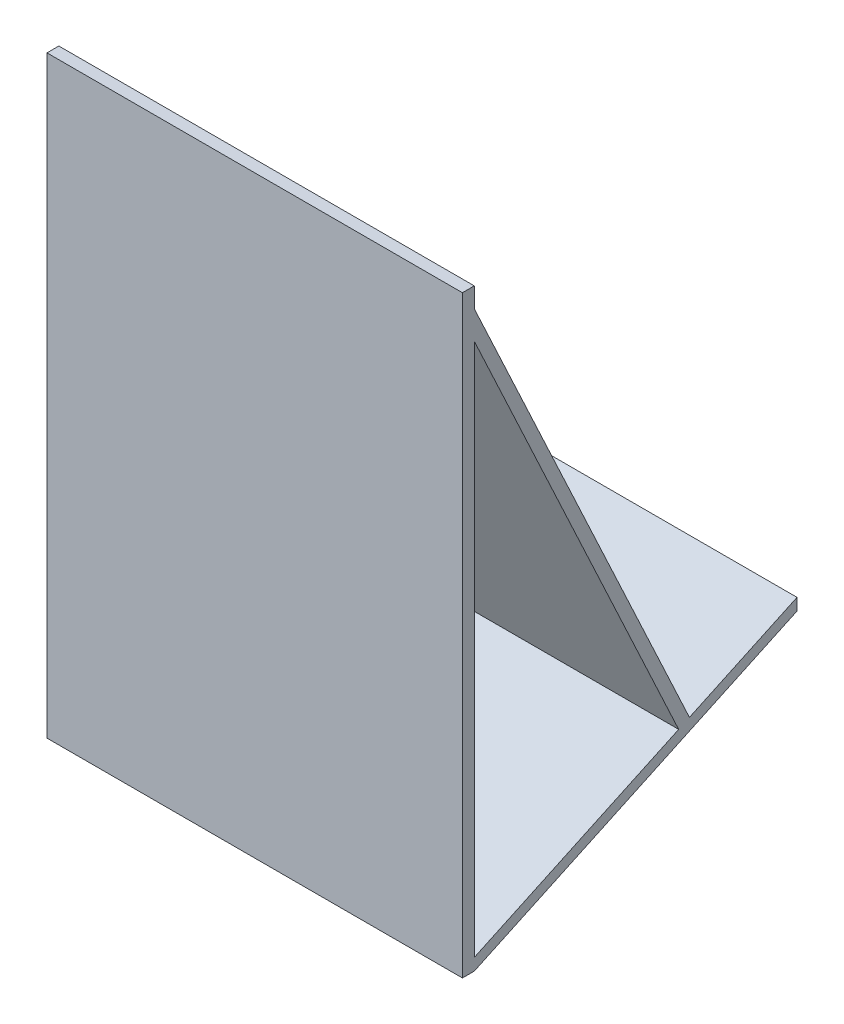
ISO-10303-21;
HEADER;
FILE_DESCRIPTION(('STEP AP214'),'2;1');
FILE_NAME('part.step','',(''),(''),'','','');
FILE_SCHEMA(('AUTOMOTIVE_DESIGN { 1 0 10303 214 1 1 1 1 }'));
ENDSEC;
DATA;
#1=APPLICATION_CONTEXT('core data for automotive mechanical design processes');
#2=APPLICATION_PROTOCOL_DEFINITION('international standard','automotive_design',2000,#1);
#3=PRODUCT_CONTEXT('',#1,'mechanical');
#4=PRODUCT('Part','Part','',(#3));
#5=PRODUCT_RELATED_PRODUCT_CATEGORY('part','',(#4));
#6=PRODUCT_DEFINITION_FORMATION('','',#4);
#7=PRODUCT_DEFINITION_CONTEXT('part definition',#1,'design');
#8=PRODUCT_DEFINITION('design','',#6,#7);
#9=PRODUCT_DEFINITION_SHAPE('','',#8);
#10=(LENGTH_UNIT() NAMED_UNIT(*) SI_UNIT(.MILLI.,.METRE.));
#11=(NAMED_UNIT(*) PLANE_ANGLE_UNIT() SI_UNIT($,.RADIAN.));
#12=(NAMED_UNIT(*) SI_UNIT($,.STERADIAN.) SOLID_ANGLE_UNIT());
#13=UNCERTAINTY_MEASURE_WITH_UNIT(LENGTH_MEASURE(1.E-05),#10,'distance_accuracy_value','');
#14=(GEOMETRIC_REPRESENTATION_CONTEXT(3) GLOBAL_UNCERTAINTY_ASSIGNED_CONTEXT((#13)) GLOBAL_UNIT_ASSIGNED_CONTEXT((#10,
#11,#12)) REPRESENTATION_CONTEXT('',''));
#15=CARTESIAN_POINT('',(0.,0.,0.));
#16=DIRECTION('',(0.,0.,1.));
#17=DIRECTION('',(1.,0.,0.));
#18=AXIS2_PLACEMENT_3D('',#15,#16,#17);
#19=CARTESIAN_POINT('',(70.,100.,4.));
#20=DIRECTION('',(-1.,0.,0.));
#21=DIRECTION('',(0.,-1.,0.));
#22=AXIS2_PLACEMENT_3D('',#19,#20,#21);
#23=PLANE('',#22);
#24=DIRECTION('',(0.,1.,0.));
#25=VECTOR('',#24,1.);
#26=CARTESIAN_POINT('',(70.,100.,0.));
#27=LINE('',#26,#25);
#28=CARTESIAN_POINT('',(70.,-96.,0.));
#29=VERTEX_POINT('',#28);
#30=CARTESIAN_POINT('',(70.,83.8313203195882,0.));
#31=VERTEX_POINT('',#30);
#32=EDGE_CURVE('E216',#29,#31,#27,.T.);
#33=ORIENTED_EDGE('',*,*,#32,.T.);
#34=DIRECTION('',(0.,-0.906307787036648,-0.422618261740704));
#35=VECTOR('',#34,1.);
#36=CARTESIAN_POINT('',(70.,94.7228506237069,5.07880398983786));
#37=LINE('',#36,#35);
#38=CARTESIAN_POINT('',(70.,-63.8810121077065,-68.8793918147853));
#39=VERTEX_POINT('',#38);
#40=EDGE_CURVE('E160',#31,#39,#37,.T.);
#41=ORIENTED_EDGE('',*,*,#40,.T.);
#42=DIRECTION('',(0.,-0.422618261740704,0.906307787036648));
#43=VECTOR('',#42,1.);
#44=CARTESIAN_POINT('',(70.,-45.2858085911155,-108.756934444398));
#45=LINE('',#44,#43);
#46=EDGE_CURVE('E185',#39,#29,#45,.T.);
#47=ORIENTED_EDGE('',*,*,#46,.T.);
#48=EDGE_LOOP('',(#33,#41,#47));
#49=FACE_BOUND('',#48,.T.);
#50=DIRECTION('',(0.,0.,-1.));
#51=VECTOR('',#50,1.);
#52=CARTESIAN_POINT('',(70.,100.,4.));
#53=LINE('',#52,#51);
#54=CARTESIAN_POINT('',(70.,100.,4.));
#55=VERTEX_POINT('',#54);
#56=CARTESIAN_POINT('',(70.,100.,0.));
#57=VERTEX_POINT('',#56);
#58=EDGE_CURVE('E11',#55,#57,#53,.T.);
#59=ORIENTED_EDGE('',*,*,#58,.F.);
#60=DIRECTION('',(0.,1.,0.));
#61=VECTOR('',#60,1.);
#62=CARTESIAN_POINT('',(70.,100.,4.));
#63=LINE('',#62,#61);
#64=CARTESIAN_POINT('',(70.,-100.,4.));
#65=VERTEX_POINT('',#64);
#66=EDGE_CURVE('E202',#65,#55,#63,.T.);
#67=ORIENTED_EDGE('',*,*,#66,.F.);
#68=DIRECTION('',(0.,0.,-1.));
#69=VECTOR('',#68,1.);
#70=CARTESIAN_POINT('',(70.,-100.,4.));
#71=LINE('',#70,#69);
#72=CARTESIAN_POINT('',(70.,-100.,0.));
#73=VERTEX_POINT('',#72);
#74=EDGE_CURVE('E215',#65,#73,#71,.T.);
#75=ORIENTED_EDGE('',*,*,#74,.T.);
#76=DIRECTION('',(0.,0.422618261740704,-0.906307787036648));
#77=VECTOR('',#76,1.);
#78=CARTESIAN_POINT('',(70.,-100.,0.));
#79=LINE('',#78,#77);
#80=CARTESIAN_POINT('',(70.,-49.2858085911155,-108.756934444398));
#81=VERTEX_POINT('',#80);
#82=EDGE_CURVE('E189',#73,#81,#79,.T.);
#83=ORIENTED_EDGE('',*,*,#82,.T.);
#84=DIRECTION('',(0.,1.,0.));
#85=VECTOR('',#84,1.);
#86=CARTESIAN_POINT('',(70.,-49.2858085911155,-108.756934444398));
#87=LINE('',#86,#85);
#88=CARTESIAN_POINT('',(70.,-45.2858085911155,-108.756934444398));
#89=VERTEX_POINT('',#88);
#90=EDGE_CURVE('E181',#81,#89,#87,.T.);
#91=ORIENTED_EDGE('',*,*,#90,.T.);
#92=CARTESIAN_POINT('',(70.,-62.1905390607437,-72.5046229629319));
#93=VERTEX_POINT('',#92);
#94=EDGE_CURVE('E186',#89,#93,#45,.T.);
#95=ORIENTED_EDGE('',*,*,#94,.T.);
#96=DIRECTION('',(0.,-0.906307787036648,-0.422618261740704));
#97=VECTOR('',#96,1.);
#98=CARTESIAN_POINT('',(70.,96.4133236706697,1.45357284169126));
#99=LINE('',#98,#97);
#100=CARTESIAN_POINT('',(70.,93.2961266521981,0.));
#101=VERTEX_POINT('',#100);
#102=EDGE_CURVE('E146',#101,#93,#99,.T.);
#103=ORIENTED_EDGE('',*,*,#102,.F.);
#104=EDGE_CURVE('E201',#101,#57,#27,.T.);
#105=ORIENTED_EDGE('',*,*,#104,.T.);
#106=EDGE_LOOP('',(#59,#67,#75,#83,#91,#95,#103,#105));
#107=FACE_BOUND('',#106,.T.);
#108=ADVANCED_FACE('F39',(#49,#107),#23,.F.);
#109=CARTESIAN_POINT('',(-70.,100.,4.));
#110=DIRECTION('',(1.,0.,0.));
#111=DIRECTION('',(0.,1.,0.));
#112=AXIS2_PLACEMENT_3D('',#109,#110,#111);
#113=PLANE('',#112);
#114=DIRECTION('',(0.,-0.906307787036648,-0.422618261740704));
#115=VECTOR('',#114,1.);
#116=CARTESIAN_POINT('',(-70.,94.7228506237069,5.07880398983786));
#117=LINE('',#116,#115);
#118=CARTESIAN_POINT('',(-70.,83.8313203195882,0.));
#119=VERTEX_POINT('',#118);
#120=CARTESIAN_POINT('',(-70.,-63.8810121077065,-68.8793918147853));
#121=VERTEX_POINT('',#120);
#122=EDGE_CURVE('E164',#119,#121,#117,.T.);
#123=ORIENTED_EDGE('',*,*,#122,.F.);
#124=DIRECTION('',(0.,-1.,0.));
#125=VECTOR('',#124,1.);
#126=CARTESIAN_POINT('',(-70.,100.,0.));
#127=LINE('',#126,#125);
#128=CARTESIAN_POINT('',(-70.,-96.,0.));
#129=VERTEX_POINT('',#128);
#130=EDGE_CURVE('E59',#119,#129,#127,.T.);
#131=ORIENTED_EDGE('',*,*,#130,.T.);
#132=DIRECTION('',(0.,0.422618261740704,-0.906307787036648));
#133=VECTOR('',#132,1.);
#134=CARTESIAN_POINT('',(-70.,-96.,0.));
#135=LINE('',#134,#133);
#136=EDGE_CURVE('E132',#129,#121,#135,.T.);
#137=ORIENTED_EDGE('',*,*,#136,.T.);
#138=EDGE_LOOP('',(#123,#131,#137));
#139=FACE_BOUND('',#138,.T.);
#140=DIRECTION('',(0.,0.,-1.));
#141=VECTOR('',#140,1.);
#142=CARTESIAN_POINT('',(-70.,-100.,4.));
#143=LINE('',#142,#141);
#144=CARTESIAN_POINT('',(-70.,-100.,4.));
#145=VERTEX_POINT('',#144);
#146=CARTESIAN_POINT('',(-70.,-100.,0.));
#147=VERTEX_POINT('',#146);
#148=EDGE_CURVE('E229',#145,#147,#143,.T.);
#149=ORIENTED_EDGE('',*,*,#148,.F.);
#150=DIRECTION('',(0.,-1.,0.));
#151=VECTOR('',#150,1.);
#152=CARTESIAN_POINT('',(-70.,100.,4.));
#153=LINE('',#152,#151);
#154=CARTESIAN_POINT('',(-70.,100.,4.));
#155=VERTEX_POINT('',#154);
#156=EDGE_CURVE('E209',#155,#145,#153,.T.);
#157=ORIENTED_EDGE('',*,*,#156,.F.);
#158=DIRECTION('',(0.,0.,-1.));
#159=VECTOR('',#158,1.);
#160=CARTESIAN_POINT('',(-70.,100.,4.));
#161=LINE('',#160,#159);
#162=CARTESIAN_POINT('',(-70.,100.,0.));
#163=VERTEX_POINT('',#162);
#164=EDGE_CURVE('E47',#155,#163,#161,.T.);
#165=ORIENTED_EDGE('',*,*,#164,.T.);
#166=CARTESIAN_POINT('',(-70.,93.2961266521981,0.));
#167=VERTEX_POINT('',#166);
#168=EDGE_CURVE('E142',#163,#167,#127,.T.);
#169=ORIENTED_EDGE('',*,*,#168,.T.);
#170=DIRECTION('',(0.,-0.906307787036648,-0.422618261740704));
#171=VECTOR('',#170,1.);
#172=CARTESIAN_POINT('',(-70.,96.4133236706697,1.45357284169126));
#173=LINE('',#172,#171);
#174=CARTESIAN_POINT('',(-70.,-62.1905390607437,-72.5046229629319));
#175=VERTEX_POINT('',#174);
#176=EDGE_CURVE('E137',#167,#175,#173,.T.);
#177=ORIENTED_EDGE('',*,*,#176,.T.);
#178=CARTESIAN_POINT('',(-70.,-45.2858085911155,-108.756934444398));
#179=VERTEX_POINT('',#178);
#180=EDGE_CURVE('E120',#175,#179,#135,.T.);
#181=ORIENTED_EDGE('',*,*,#180,.T.);
#182=DIRECTION('',(0.,-1.,0.));
#183=VECTOR('',#182,1.);
#184=CARTESIAN_POINT('',(-70.,-45.2858085911155,-108.756934444398));
#185=LINE('',#184,#183);
#186=CARTESIAN_POINT('',(-70.,-49.2858085911156,-108.756934444398));
#187=VERTEX_POINT('',#186);
#188=EDGE_CURVE('E173',#179,#187,#185,.T.);
#189=ORIENTED_EDGE('',*,*,#188,.T.);
#190=DIRECTION('',(0.,-0.422618261740704,0.906307787036648));
#191=VECTOR('',#190,1.);
#192=CARTESIAN_POINT('',(-70.,-49.2858085911156,-108.756934444398));
#193=LINE('',#192,#191);
#194=EDGE_CURVE('E133',#187,#147,#193,.T.);
#195=ORIENTED_EDGE('',*,*,#194,.T.);
#196=EDGE_LOOP('',(#149,#157,#165,#169,#177,#181,#189,#195));
#197=FACE_BOUND('',#196,.T.);
#198=ADVANCED_FACE('F139',(#139,#197),#113,.F.);
#199=CARTESIAN_POINT('',(0.,0.,4.));
#200=DIRECTION('',(0.,0.,1.));
#201=DIRECTION('',(1.,0.,0.));
#202=AXIS2_PLACEMENT_3D('',#199,#200,#201);
#203=PLANE('',#202);
#204=ORIENTED_EDGE('',*,*,#156,.T.);
#205=DIRECTION('',(1.,0.,0.));
#206=VECTOR('',#205,1.);
#207=CARTESIAN_POINT('',(-70.,-100.,4.));
#208=LINE('',#207,#206);
#209=EDGE_CURVE('E212',#145,#65,#208,.T.);
#210=ORIENTED_EDGE('',*,*,#209,.T.);
#211=ORIENTED_EDGE('',*,*,#66,.T.);
#212=DIRECTION('',(-1.,0.,0.));
#213=VECTOR('',#212,1.);
#214=CARTESIAN_POINT('',(-70.,100.,4.));
#215=LINE('',#214,#213);
#216=EDGE_CURVE('E205',#55,#155,#215,.T.);
#217=ORIENTED_EDGE('',*,*,#216,.T.);
#218=EDGE_LOOP('',(#204,#210,#211,#217));
#219=FACE_BOUND('',#218,.T.);
#220=ADVANCED_FACE('F255',(#219),#203,.T.);
#221=CARTESIAN_POINT('',(0.,0.,0.));
#222=DIRECTION('',(0.,0.,1.));
#223=DIRECTION('',(1.,0.,0.));
#224=AXIS2_PLACEMENT_3D('',#221,#222,#223);
#225=PLANE('',#224);
#226=DIRECTION('',(-1.,0.,0.));
#227=VECTOR('',#226,1.);
#228=CARTESIAN_POINT('',(0.,83.8313203195882,0.));
#229=LINE('',#228,#227);
#230=EDGE_CURVE('E54',#31,#119,#229,.T.);
#231=ORIENTED_EDGE('',*,*,#230,.F.);
#232=ORIENTED_EDGE('',*,*,#32,.F.);
#233=DIRECTION('',(-1.,0.,0.));
#234=VECTOR('',#233,1.);
#235=CARTESIAN_POINT('',(1.00000000000004,-96.,0.));
#236=LINE('',#235,#234);
#237=EDGE_CURVE('E193',#29,#129,#236,.T.);
#238=ORIENTED_EDGE('',*,*,#237,.T.);
#239=ORIENTED_EDGE('',*,*,#130,.F.);
#240=EDGE_LOOP('',(#231,#232,#238,#239));
#241=FACE_BOUND('',#240,.T.);
#242=ADVANCED_FACE('F281',(#241),#225,.F.);
#243=DIRECTION('',(1.,0.,0.));
#244=VECTOR('',#243,1.);
#245=CARTESIAN_POINT('',(0.,93.2961266521981,0.));
#246=LINE('',#245,#244);
#247=EDGE_CURVE('E168',#167,#101,#246,.T.);
#248=ORIENTED_EDGE('',*,*,#247,.F.);
#249=ORIENTED_EDGE('',*,*,#168,.F.);
#250=DIRECTION('',(-1.,0.,0.));
#251=VECTOR('',#250,1.);
#252=CARTESIAN_POINT('',(-70.,100.,0.));
#253=LINE('',#252,#251);
#254=EDGE_CURVE('E219',#57,#163,#253,.T.);
#255=ORIENTED_EDGE('',*,*,#254,.F.);
#256=ORIENTED_EDGE('',*,*,#104,.F.);
#257=EDGE_LOOP('',(#248,#249,#255,#256));
#258=FACE_BOUND('',#257,.T.);
#259=ADVANCED_FACE('F238',(#258),#225,.F.);
#260=CARTESIAN_POINT('',(1.00000000000004,-96.,0.));
#261=DIRECTION('',(0.,-0.906307787036648,-0.422618261740704));
#262=DIRECTION('',(0.,0.422618261740704,-0.906307787036648));
#263=AXIS2_PLACEMENT_3D('',#260,#261,#262);
#264=PLANE('',#263);
#265=DIRECTION('',(1.,0.,0.));
#266=VECTOR('',#265,1.);
#267=CARTESIAN_POINT('',(-70.,-63.8810121077065,-68.8793918147853));
#268=LINE('',#267,#266);
#269=EDGE_CURVE('E152',#121,#39,#268,.T.);
#270=ORIENTED_EDGE('',*,*,#269,.F.);
#271=ORIENTED_EDGE('',*,*,#136,.F.);
#272=ORIENTED_EDGE('',*,*,#237,.F.);
#273=ORIENTED_EDGE('',*,*,#46,.F.);
#274=EDGE_LOOP('',(#270,#271,#272,#273));
#275=FACE_BOUND('',#274,.T.);
#276=ADVANCED_FACE('F263',(#275),#264,.F.);
#277=DIRECTION('',(-1.,0.,0.));
#278=VECTOR('',#277,1.);
#279=CARTESIAN_POINT('',(-70.,-62.1905390607437,-72.5046229629319));
#280=LINE('',#279,#278);
#281=EDGE_CURVE('E125',#93,#175,#280,.T.);
#282=ORIENTED_EDGE('',*,*,#281,.F.);
#283=ORIENTED_EDGE('',*,*,#94,.F.);
#284=DIRECTION('',(-1.,0.,0.));
#285=VECTOR('',#284,1.);
#286=CARTESIAN_POINT('',(0.999999999999991,-45.2858085911155,-108.756934444398));
#287=LINE('',#286,#285);
#288=EDGE_CURVE('E127',#89,#179,#287,.T.);
#289=ORIENTED_EDGE('',*,*,#288,.T.);
#290=ORIENTED_EDGE('',*,*,#180,.F.);
#291=EDGE_LOOP('',(#282,#283,#289,#290));
#292=FACE_BOUND('',#291,.T.);
#293=ADVANCED_FACE('F122',(#292),#264,.F.);
#294=CARTESIAN_POINT('',(-70.,100.,4.));
#295=DIRECTION('',(0.,-1.,0.));
#296=DIRECTION('',(0.,0.,-1.));
#297=AXIS2_PLACEMENT_3D('',#294,#295,#296);
#298=PLANE('',#297);
#299=ORIENTED_EDGE('',*,*,#254,.T.);
#300=ORIENTED_EDGE('',*,*,#164,.F.);
#301=ORIENTED_EDGE('',*,*,#216,.F.);
#302=ORIENTED_EDGE('',*,*,#58,.T.);
#303=EDGE_LOOP('',(#299,#300,#301,#302));
#304=FACE_BOUND('',#303,.T.);
#305=ADVANCED_FACE('F256',(#304),#298,.F.);
#306=CARTESIAN_POINT('',(-70.,-100.,4.));
#307=DIRECTION('',(0.,1.,0.));
#308=DIRECTION('',(0.,0.,1.));
#309=AXIS2_PLACEMENT_3D('',#306,#307,#308);
#310=PLANE('',#309);
#311=DIRECTION('',(1.,0.,0.));
#312=VECTOR('',#311,1.);
#313=CARTESIAN_POINT('',(-70.,-100.,0.));
#314=LINE('',#313,#312);
#315=EDGE_CURVE('E206',#147,#73,#314,.T.);
#316=ORIENTED_EDGE('',*,*,#315,.T.);
#317=ORIENTED_EDGE('',*,*,#74,.F.);
#318=ORIENTED_EDGE('',*,*,#209,.F.);
#319=ORIENTED_EDGE('',*,*,#148,.T.);
#320=EDGE_LOOP('',(#316,#317,#318,#319));
#321=FACE_BOUND('',#320,.T.);
#322=ADVANCED_FACE('F252',(#321),#310,.F.);
#323=CARTESIAN_POINT('',(0.,0.,-108.756934444398));
#324=DIRECTION('',(0.,0.,-1.));
#325=DIRECTION('',(-1.,0.,0.));
#326=AXIS2_PLACEMENT_3D('',#323,#324,#325);
#327=PLANE('',#326);
#328=DIRECTION('',(1.,0.,0.));
#329=VECTOR('',#328,1.);
#330=CARTESIAN_POINT('',(0.999999999999991,-49.2858085911155,-108.756934444398));
#331=LINE('',#330,#329);
#332=EDGE_CURVE('E194',#187,#81,#331,.T.);
#333=ORIENTED_EDGE('',*,*,#332,.F.);
#334=ORIENTED_EDGE('',*,*,#188,.F.);
#335=ORIENTED_EDGE('',*,*,#288,.F.);
#336=ORIENTED_EDGE('',*,*,#90,.F.);
#337=EDGE_LOOP('',(#333,#334,#335,#336));
#338=FACE_BOUND('',#337,.T.);
#339=ADVANCED_FACE('F244',(#338),#327,.T.);
#340=CARTESIAN_POINT('',(1.00000000000004,-100.,0.));
#341=DIRECTION('',(0.,0.906307787036648,0.422618261740704));
#342=DIRECTION('',(0.,-0.422618261740704,0.906307787036648));
#343=AXIS2_PLACEMENT_3D('',#340,#341,#342);
#344=PLANE('',#343);
#345=ORIENTED_EDGE('',*,*,#332,.T.);
#346=ORIENTED_EDGE('',*,*,#82,.F.);
#347=ORIENTED_EDGE('',*,*,#315,.F.);
#348=ORIENTED_EDGE('',*,*,#194,.F.);
#349=EDGE_LOOP('',(#345,#346,#347,#348));
#350=FACE_BOUND('',#349,.T.);
#351=ADVANCED_FACE('F249',(#350),#344,.F.);
#352=CARTESIAN_POINT('',(-70.,96.4133236706697,1.45357284169126));
#353=DIRECTION('',(0.,-0.422618261740704,0.906307787036648));
#354=DIRECTION('',(0.,-0.906307787036648,-0.422618261740704));
#355=AXIS2_PLACEMENT_3D('',#352,#353,#354);
#356=PLANE('',#355);
#357=ORIENTED_EDGE('',*,*,#176,.F.);
#358=ORIENTED_EDGE('',*,*,#247,.T.);
#359=ORIENTED_EDGE('',*,*,#102,.T.);
#360=ORIENTED_EDGE('',*,*,#281,.T.);
#361=EDGE_LOOP('',(#357,#358,#359,#360));
#362=FACE_BOUND('',#361,.T.);
#363=ADVANCED_FACE('F149',(#362),#356,.F.);
#364=CARTESIAN_POINT('',(-70.,94.7228506237069,5.07880398983786));
#365=DIRECTION('',(0.,0.422618261740704,-0.906307787036648));
#366=DIRECTION('',(0.,0.906307787036648,0.422618261740704));
#367=AXIS2_PLACEMENT_3D('',#364,#365,#366);
#368=PLANE('',#367);
#369=ORIENTED_EDGE('',*,*,#40,.F.);
#370=ORIENTED_EDGE('',*,*,#230,.T.);
#371=ORIENTED_EDGE('',*,*,#122,.T.);
#372=ORIENTED_EDGE('',*,*,#269,.T.);
#373=EDGE_LOOP('',(#369,#370,#371,#372));
#374=FACE_BOUND('',#373,.T.);
#375=ADVANCED_FACE('F276',(#374),#368,.F.);
#376=CLOSED_SHELL('',(#108,#198,#220,#242,#259,#276,#293,#305,#322,#339,#351,#363,#375));
#377=MANIFOLD_SOLID_BREP('B2',#376);
#378=ADVANCED_BREP_SHAPE_REPRESENTATION('',(#18,#377),#14);
#379=SHAPE_DEFINITION_REPRESENTATION(#9,#378);
ENDSEC;
END-ISO-10303-21;
